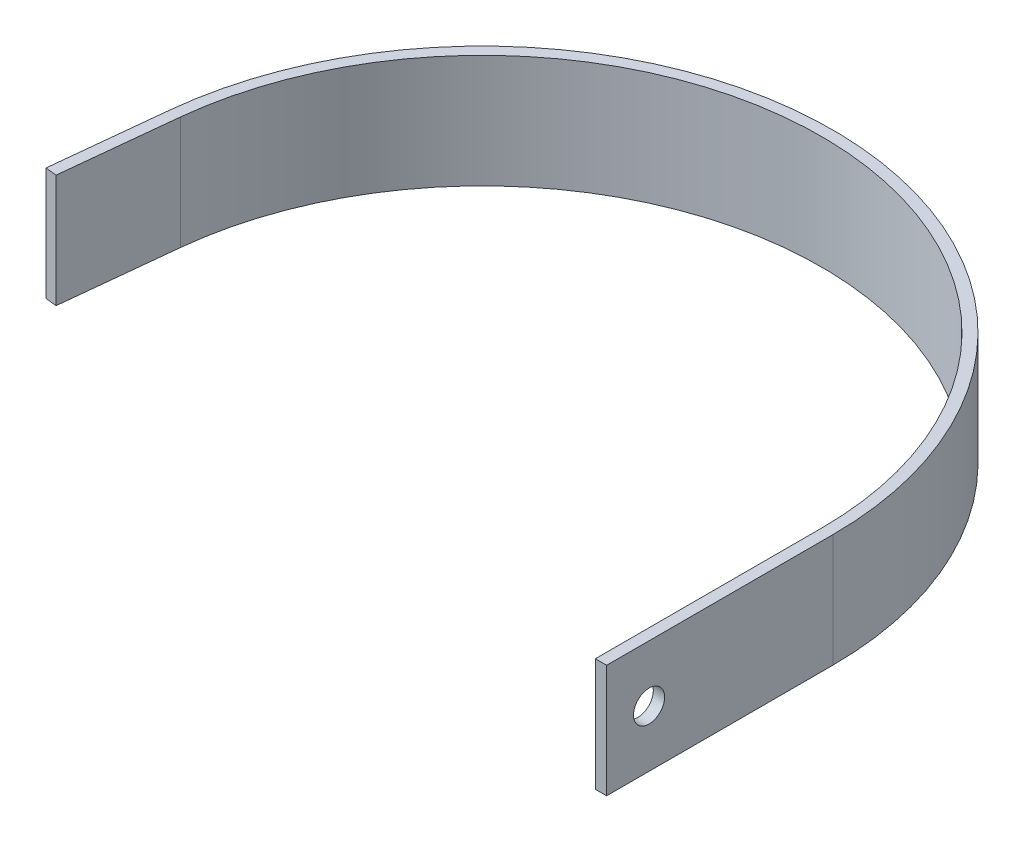
ISO-10303-21;
HEADER;
FILE_DESCRIPTION(('STEP AP214'),'2;1');
FILE_NAME('part.step','',(''),(''),'','','');
FILE_SCHEMA(('AUTOMOTIVE_DESIGN { 1 0 10303 214 1 1 1 1 }'));
ENDSEC;
DATA;
#1=APPLICATION_CONTEXT('core data for automotive mechanical design processes');
#2=APPLICATION_PROTOCOL_DEFINITION('international standard','automotive_design',2000,#1);
#3=PRODUCT_CONTEXT('',#1,'mechanical');
#4=PRODUCT('Part','Part','',(#3));
#5=PRODUCT_RELATED_PRODUCT_CATEGORY('part','',(#4));
#6=PRODUCT_DEFINITION_FORMATION('','',#4);
#7=PRODUCT_DEFINITION_CONTEXT('part definition',#1,'design');
#8=PRODUCT_DEFINITION('design','',#6,#7);
#9=PRODUCT_DEFINITION_SHAPE('','',#8);
#10=(LENGTH_UNIT() NAMED_UNIT(*) SI_UNIT(.MILLI.,.METRE.));
#11=(NAMED_UNIT(*) PLANE_ANGLE_UNIT() SI_UNIT($,.RADIAN.));
#12=(NAMED_UNIT(*) SI_UNIT($,.STERADIAN.) SOLID_ANGLE_UNIT());
#13=UNCERTAINTY_MEASURE_WITH_UNIT(LENGTH_MEASURE(1.E-05),#10,'distance_accuracy_value','');
#14=(GEOMETRIC_REPRESENTATION_CONTEXT(3) GLOBAL_UNCERTAINTY_ASSIGNED_CONTEXT((#13)) GLOBAL_UNIT_ASSIGNED_CONTEXT((#10,
#11,#12)) REPRESENTATION_CONTEXT('',''));
#15=CARTESIAN_POINT('',(0.,0.,0.));
#16=DIRECTION('',(0.,0.,1.));
#17=DIRECTION('',(1.,0.,0.));
#18=AXIS2_PLACEMENT_3D('',#15,#16,#17);
#19=CARTESIAN_POINT('',(59.1497340859762,20.,-7.68770354477943));
#20=DIRECTION('',(0.,-1.,0.));
#21=DIRECTION('',(0.,0.,-1.));
#22=AXIS2_PLACEMENT_3D('',#19,#20,#21);
#23=CYLINDRICAL_SURFACE('',#22,60.);
#24=CARTESIAN_POINT('',(59.1497340859762,0.,-7.68770354477943));
#25=DIRECTION('',(0.,-1.,0.));
#26=DIRECTION('',(0.,0.,-1.));
#27=AXIS2_PLACEMENT_3D('',#24,#25,#26);
#28=CIRCLE('',#27,60.);
#29=CARTESIAN_POINT('',(-0.521579636120151,0.,-13.9594113408387));
#30=VERTEX_POINT('',#29);
#31=CARTESIAN_POINT('',(119.149734085976,0.,-7.68770354477943));
#32=VERTEX_POINT('',#31);
#33=EDGE_CURVE('E130',#30,#32,#28,.T.);
#34=ORIENTED_EDGE('',*,*,#33,.T.);
#35=DIRECTION('',(0.,-1.,0.));
#36=VECTOR('',#35,1.);
#37=CARTESIAN_POINT('',(119.149734085976,20.,-7.68770354477943));
#38=LINE('',#37,#36);
#39=CARTESIAN_POINT('',(119.149734085976,20.,-7.68770354477943));
#40=VERTEX_POINT('',#39);
#41=EDGE_CURVE('E11',#40,#32,#38,.T.);
#42=ORIENTED_EDGE('',*,*,#41,.F.);
#43=CARTESIAN_POINT('',(59.1497340859762,20.,-7.68770354477943));
#44=DIRECTION('',(0.,-1.,0.));
#45=DIRECTION('',(0.,0.,-1.));
#46=AXIS2_PLACEMENT_3D('',#43,#44,#45);
#47=CIRCLE('',#46,60.);
#48=CARTESIAN_POINT('',(-0.521579636120151,20.,-13.9594113408387));
#49=VERTEX_POINT('',#48);
#50=EDGE_CURVE('E145',#49,#40,#47,.T.);
#51=ORIENTED_EDGE('',*,*,#50,.F.);
#52=DIRECTION('',(0.,-1.,0.));
#53=VECTOR('',#52,1.);
#54=CARTESIAN_POINT('',(-0.521579636120151,20.,-13.9594113408387));
#55=LINE('',#54,#53);
#56=EDGE_CURVE('E126',#49,#30,#55,.T.);
#57=ORIENTED_EDGE('',*,*,#56,.T.);
#58=EDGE_LOOP('',(#34,#42,#51,#57));
#59=FACE_BOUND('',#58,.T.);
#60=ADVANCED_FACE('F34',(#59),#23,.F.);
#61=CARTESIAN_POINT('',(119.149734085976,20.,-7.68770354477943));
#62=DIRECTION('',(1.,0.,0.));
#63=DIRECTION('',(0.,0.,-1.));
#64=AXIS2_PLACEMENT_3D('',#61,#62,#63);
#65=PLANE('',#64);
#66=CARTESIAN_POINT('',(119.149734085976,10.,24.8122964552206));
#67=DIRECTION('',(1.,0.,0.));
#68=DIRECTION('',(0.,0.,-1.));
#69=AXIS2_PLACEMENT_3D('',#66,#67,#68);
#70=CIRCLE('',#69,2.75);
#71=CARTESIAN_POINT('',(119.149734085976,10.,22.0622964552206));
#72=VERTEX_POINT('',#71);
#73=EDGE_CURVE('E134',#72,#72,#70,.F.);
#74=ORIENTED_EDGE('',*,*,#73,.F.);
#75=EDGE_LOOP('',(#74));
#76=FACE_BOUND('',#75,.T.);
#77=DIRECTION('',(0.,0.,1.));
#78=VECTOR('',#77,1.);
#79=CARTESIAN_POINT('',(119.149734085976,0.,-7.68770354477943));
#80=LINE('',#79,#78);
#81=CARTESIAN_POINT('',(119.149734085976,0.,32.3122964552206));
#82=VERTEX_POINT('',#81);
#83=EDGE_CURVE('E133',#32,#82,#80,.T.);
#84=ORIENTED_EDGE('',*,*,#83,.T.);
#85=DIRECTION('',(0.,-1.,0.));
#86=VECTOR('',#85,1.);
#87=CARTESIAN_POINT('',(119.149734085976,20.,32.3122964552206));
#88=LINE('',#87,#86);
#89=CARTESIAN_POINT('',(119.149734085976,20.,32.3122964552206));
#90=VERTEX_POINT('',#89);
#91=EDGE_CURVE('E42',#90,#82,#88,.T.);
#92=ORIENTED_EDGE('',*,*,#91,.F.);
#93=DIRECTION('',(0.,0.,1.));
#94=VECTOR('',#93,1.);
#95=CARTESIAN_POINT('',(119.149734085976,20.,-7.68770354477943));
#96=LINE('',#95,#94);
#97=EDGE_CURVE('E93',#40,#90,#96,.T.);
#98=ORIENTED_EDGE('',*,*,#97,.F.);
#99=ORIENTED_EDGE('',*,*,#41,.T.);
#100=EDGE_LOOP('',(#84,#92,#98,#99));
#101=FACE_BOUND('',#100,.T.);
#102=ADVANCED_FACE('F193',(#76,#101),#65,.F.);
#103=CARTESIAN_POINT('',(119.149734085976,20.,32.3122964552206));
#104=DIRECTION('',(0.,0.,-1.));
#105=DIRECTION('',(-1.,0.,0.));
#106=AXIS2_PLACEMENT_3D('',#103,#104,#105);
#107=PLANE('',#106);
#108=DIRECTION('',(1.,0.,0.));
#109=VECTOR('',#108,1.);
#110=CARTESIAN_POINT('',(119.149734085976,0.,32.3122964552206));
#111=LINE('',#110,#109);
#112=CARTESIAN_POINT('',(121.149734085976,0.,32.3122964552206));
#113=VERTEX_POINT('',#112);
#114=EDGE_CURVE('E136',#82,#113,#111,.T.);
#115=ORIENTED_EDGE('',*,*,#114,.T.);
#116=DIRECTION('',(0.,-1.,0.));
#117=VECTOR('',#116,1.);
#118=CARTESIAN_POINT('',(121.149734085976,20.,32.3122964552206));
#119=LINE('',#118,#117);
#120=CARTESIAN_POINT('',(121.149734085976,20.,32.3122964552206));
#121=VERTEX_POINT('',#120);
#122=EDGE_CURVE('E152',#121,#113,#119,.T.);
#123=ORIENTED_EDGE('',*,*,#122,.F.);
#124=DIRECTION('',(1.,0.,0.));
#125=VECTOR('',#124,1.);
#126=CARTESIAN_POINT('',(119.149734085976,20.,32.3122964552206));
#127=LINE('',#126,#125);
#128=EDGE_CURVE('E160',#90,#121,#127,.T.);
#129=ORIENTED_EDGE('',*,*,#128,.F.);
#130=ORIENTED_EDGE('',*,*,#91,.T.);
#131=EDGE_LOOP('',(#115,#123,#129,#130));
#132=FACE_BOUND('',#131,.T.);
#133=ADVANCED_FACE('F158',(#132),#107,.F.);
#134=CARTESIAN_POINT('',(121.149734085976,20.,32.3122964552206));
#135=DIRECTION('',(-1.,0.,0.));
#136=DIRECTION('',(0.,0.,1.));
#137=AXIS2_PLACEMENT_3D('',#134,#135,#136);
#138=PLANE('',#137);
#139=CARTESIAN_POINT('',(121.149734085976,10.,24.8122964552206));
#140=DIRECTION('',(1.,0.,0.));
#141=DIRECTION('',(0.,0.,-1.));
#142=AXIS2_PLACEMENT_3D('',#139,#140,#141);
#143=CIRCLE('',#142,2.75);
#144=CARTESIAN_POINT('',(121.149734085976,10.,22.0622964552206));
#145=VERTEX_POINT('',#144);
#146=EDGE_CURVE('E180',#145,#145,#143,.T.);
#147=ORIENTED_EDGE('',*,*,#146,.F.);
#148=EDGE_LOOP('',(#147));
#149=FACE_BOUND('',#148,.T.);
#150=DIRECTION('',(0.,0.,-1.));
#151=VECTOR('',#150,1.);
#152=CARTESIAN_POINT('',(121.149734085976,0.,32.3122964552206));
#153=LINE('',#152,#151);
#154=CARTESIAN_POINT('',(121.149734085976,0.,-7.68770354477949));
#155=VERTEX_POINT('',#154);
#156=EDGE_CURVE('E138',#113,#155,#153,.T.);
#157=ORIENTED_EDGE('',*,*,#156,.T.);
#158=DIRECTION('',(0.,-1.,0.));
#159=VECTOR('',#158,1.);
#160=CARTESIAN_POINT('',(121.149734085976,20.,-7.68770354477949));
#161=LINE('',#160,#159);
#162=CARTESIAN_POINT('',(121.149734085976,20.,-7.68770354477949));
#163=VERTEX_POINT('',#162);
#164=EDGE_CURVE('E149',#163,#155,#161,.T.);
#165=ORIENTED_EDGE('',*,*,#164,.F.);
#166=DIRECTION('',(0.,0.,-1.));
#167=VECTOR('',#166,1.);
#168=CARTESIAN_POINT('',(121.149734085976,20.,32.3122964552206));
#169=LINE('',#168,#167);
#170=EDGE_CURVE('E172',#121,#163,#169,.T.);
#171=ORIENTED_EDGE('',*,*,#170,.F.);
#172=ORIENTED_EDGE('',*,*,#122,.T.);
#173=EDGE_LOOP('',(#157,#165,#171,#172));
#174=FACE_BOUND('',#173,.T.);
#175=ADVANCED_FACE('F168',(#149,#174),#138,.F.);
#176=CARTESIAN_POINT('',(59.1497340859762,20.,-7.68770354477949));
#177=DIRECTION('',(0.,-1.,0.));
#178=DIRECTION('',(0.,0.,-1.));
#179=AXIS2_PLACEMENT_3D('',#176,#177,#178);
#180=CYLINDRICAL_SURFACE('',#179,62.);
#181=CARTESIAN_POINT('',(59.1497340859762,0.,-7.68770354477949));
#182=DIRECTION('',(0.,1.,0.));
#183=DIRECTION('',(0.,0.,-1.));
#184=AXIS2_PLACEMENT_3D('',#181,#182,#183);
#185=CIRCLE('',#184,62.);
#186=CARTESIAN_POINT('',(-2.51062342685671,0.,-14.168468267374));
#187=VERTEX_POINT('',#186);
#188=EDGE_CURVE('E140',#155,#187,#185,.T.);
#189=ORIENTED_EDGE('',*,*,#188,.T.);
#190=DIRECTION('',(0.,-1.,0.));
#191=VECTOR('',#190,1.);
#192=CARTESIAN_POINT('',(-2.51062342685671,20.,-14.168468267374));
#193=LINE('',#192,#191);
#194=CARTESIAN_POINT('',(-2.51062342685671,20.,-14.168468267374));
#195=VERTEX_POINT('',#194);
#196=EDGE_CURVE('E121',#195,#187,#193,.T.);
#197=ORIENTED_EDGE('',*,*,#196,.F.);
#198=CARTESIAN_POINT('',(59.1497340859762,20.,-7.68770354477949));
#199=DIRECTION('',(0.,1.,0.));
#200=DIRECTION('',(0.,0.,-1.));
#201=AXIS2_PLACEMENT_3D('',#198,#199,#200);
#202=CIRCLE('',#201,62.);
#203=EDGE_CURVE('E112',#163,#195,#202,.T.);
#204=ORIENTED_EDGE('',*,*,#203,.F.);
#205=ORIENTED_EDGE('',*,*,#164,.T.);
#206=EDGE_LOOP('',(#189,#197,#204,#205));
#207=FACE_BOUND('',#206,.T.);
#208=ADVANCED_FACE('F171',(#207),#180,.T.);
#209=CARTESIAN_POINT('',(-4.60119269220976,20.,5.72196963999151));
#210=DIRECTION('',(0.994521895368273,0.,0.104528463267653));
#211=DIRECTION('',(0.104528463267653,0.,-0.994521895368273));
#212=AXIS2_PLACEMENT_3D('',#209,#210,#211);
#213=PLANE('',#212);
#214=DIRECTION('',(-0.104528463267653,0.,0.994521895368273));
#215=VECTOR('',#214,1.);
#216=CARTESIAN_POINT('',(-4.60119269220976,0.,5.72196963999151));
#217=LINE('',#216,#215);
#218=CARTESIAN_POINT('',(-4.60119269220976,0.,5.72196963999151));
#219=VERTEX_POINT('',#218);
#220=EDGE_CURVE('E120',#187,#219,#217,.T.);
#221=ORIENTED_EDGE('',*,*,#220,.T.);
#222=DIRECTION('',(0.,-1.,0.));
#223=VECTOR('',#222,1.);
#224=CARTESIAN_POINT('',(-4.60119269220976,20.,5.72196963999151));
#225=LINE('',#224,#223);
#226=CARTESIAN_POINT('',(-4.60119269220976,20.,5.72196963999151));
#227=VERTEX_POINT('',#226);
#228=EDGE_CURVE('E117',#227,#219,#225,.T.);
#229=ORIENTED_EDGE('',*,*,#228,.F.);
#230=DIRECTION('',(-0.104528463267653,0.,0.994521895368273));
#231=VECTOR('',#230,1.);
#232=CARTESIAN_POINT('',(-4.60119269220976,20.,5.72196963999151));
#233=LINE('',#232,#231);
#234=EDGE_CURVE('E106',#195,#227,#233,.T.);
#235=ORIENTED_EDGE('',*,*,#234,.F.);
#236=ORIENTED_EDGE('',*,*,#196,.T.);
#237=EDGE_LOOP('',(#221,#229,#235,#236));
#238=FACE_BOUND('',#237,.T.);
#239=ADVANCED_FACE('F118',(#238),#213,.F.);
#240=CARTESIAN_POINT('',(-2.61214890147322,20.,5.93102656652682));
#241=DIRECTION('',(0.104528463267653,0.,-0.994521895368273));
#242=DIRECTION('',(-0.994521895368273,0.,-0.104528463267653));
#243=AXIS2_PLACEMENT_3D('',#240,#241,#242);
#244=PLANE('',#243);
#245=DIRECTION('',(0.994521895368273,0.,0.104528463267653));
#246=VECTOR('',#245,1.);
#247=CARTESIAN_POINT('',(-2.61214890147322,0.,5.93102656652682));
#248=LINE('',#247,#246);
#249=CARTESIAN_POINT('',(-2.61214890147322,0.,5.93102656652682));
#250=VERTEX_POINT('',#249);
#251=EDGE_CURVE('E79',#219,#250,#248,.T.);
#252=ORIENTED_EDGE('',*,*,#251,.T.);
#253=DIRECTION('',(0.,-1.,0.));
#254=VECTOR('',#253,1.);
#255=CARTESIAN_POINT('',(-2.61214890147322,20.,5.93102656652682));
#256=LINE('',#255,#254);
#257=CARTESIAN_POINT('',(-2.61214890147322,20.,5.93102656652682));
#258=VERTEX_POINT('',#257);
#259=EDGE_CURVE('E122',#258,#250,#256,.T.);
#260=ORIENTED_EDGE('',*,*,#259,.F.);
#261=DIRECTION('',(0.994521895368273,0.,0.104528463267653));
#262=VECTOR('',#261,1.);
#263=CARTESIAN_POINT('',(-2.61214890147322,20.,5.93102656652682));
#264=LINE('',#263,#262);
#265=EDGE_CURVE('E110',#227,#258,#264,.T.);
#266=ORIENTED_EDGE('',*,*,#265,.F.);
#267=ORIENTED_EDGE('',*,*,#228,.T.);
#268=EDGE_LOOP('',(#252,#260,#266,#267));
#269=FACE_BOUND('',#268,.T.);
#270=ADVANCED_FACE('F124',(#269),#244,.F.);
#271=CARTESIAN_POINT('',(-0.521579636120151,20.,-13.9594113408387));
#272=DIRECTION('',(-0.994521895368273,0.,-0.104528463267653));
#273=DIRECTION('',(-0.104528463267653,0.,0.994521895368273));
#274=AXIS2_PLACEMENT_3D('',#271,#272,#273);
#275=PLANE('',#274);
#276=DIRECTION('',(0.104528463267653,0.,-0.994521895368273));
#277=VECTOR('',#276,1.);
#278=CARTESIAN_POINT('',(-0.521579636120151,0.,-13.9594113408387));
#279=LINE('',#278,#277);
#280=EDGE_CURVE('E85',#250,#30,#279,.T.);
#281=ORIENTED_EDGE('',*,*,#280,.T.);
#282=ORIENTED_EDGE('',*,*,#56,.F.);
#283=DIRECTION('',(0.104528463267653,0.,-0.994521895368273));
#284=VECTOR('',#283,1.);
#285=CARTESIAN_POINT('',(-0.521579636120151,20.,-13.9594113408387));
#286=LINE('',#285,#284);
#287=EDGE_CURVE('E50',#258,#49,#286,.T.);
#288=ORIENTED_EDGE('',*,*,#287,.F.);
#289=ORIENTED_EDGE('',*,*,#259,.T.);
#290=EDGE_LOOP('',(#281,#282,#288,#289));
#291=FACE_BOUND('',#290,.T.);
#292=ADVANCED_FACE('F203',(#291),#275,.F.);
#293=CARTESIAN_POINT('',(59.1497340859762,20.,-7.68770354477943));
#294=DIRECTION('',(0.,-1.,0.));
#295=DIRECTION('',(0.,0.,-1.));
#296=AXIS2_PLACEMENT_3D('',#293,#294,#295);
#297=PLANE('',#296);
#298=ORIENTED_EDGE('',*,*,#50,.T.);
#299=ORIENTED_EDGE('',*,*,#97,.T.);
#300=ORIENTED_EDGE('',*,*,#128,.T.);
#301=ORIENTED_EDGE('',*,*,#170,.T.);
#302=ORIENTED_EDGE('',*,*,#203,.T.);
#303=ORIENTED_EDGE('',*,*,#234,.T.);
#304=ORIENTED_EDGE('',*,*,#265,.T.);
#305=ORIENTED_EDGE('',*,*,#287,.T.);
#306=EDGE_LOOP('',(#298,#299,#300,#301,#302,#303,#304,#305));
#307=FACE_BOUND('',#306,.T.);
#308=ADVANCED_FACE('F108',(#307),#297,.F.);
#309=CARTESIAN_POINT('',(59.1497340859762,0.,-7.68770354477943));
#310=DIRECTION('',(0.,-1.,0.));
#311=DIRECTION('',(0.,0.,-1.));
#312=AXIS2_PLACEMENT_3D('',#309,#310,#311);
#313=PLANE('',#312);
#314=ORIENTED_EDGE('',*,*,#33,.F.);
#315=ORIENTED_EDGE('',*,*,#280,.F.);
#316=ORIENTED_EDGE('',*,*,#251,.F.);
#317=ORIENTED_EDGE('',*,*,#220,.F.);
#318=ORIENTED_EDGE('',*,*,#188,.F.);
#319=ORIENTED_EDGE('',*,*,#156,.F.);
#320=ORIENTED_EDGE('',*,*,#114,.F.);
#321=ORIENTED_EDGE('',*,*,#83,.F.);
#322=EDGE_LOOP('',(#314,#315,#316,#317,#318,#319,#320,#321));
#323=FACE_BOUND('',#322,.T.);
#324=ADVANCED_FACE('F164',(#323),#313,.T.);
#325=CARTESIAN_POINT('',(111.371559492924,10.,24.8122964552205));
#326=DIRECTION('',(1.,0.,0.));
#327=DIRECTION('',(0.,0.,-1.));
#328=AXIS2_PLACEMENT_3D('',#325,#326,#327);
#329=CYLINDRICAL_SURFACE('',#328,2.75);
#330=ORIENTED_EDGE('',*,*,#73,.T.);
#331=EDGE_LOOP('',(#330));
#332=FACE_BOUND('',#331,.T.);
#333=ORIENTED_EDGE('',*,*,#146,.T.);
#334=EDGE_LOOP('',(#333));
#335=FACE_BOUND('',#334,.T.);
#336=ADVANCED_FACE('F184',(#332,#335),#329,.F.);
#337=CLOSED_SHELL('',(#60,#102,#133,#175,#208,#239,#270,#292,#308,#324,#336));
#338=MANIFOLD_SOLID_BREP('B2',#337);
#339=ADVANCED_BREP_SHAPE_REPRESENTATION('',(#18,#338),#14);
#340=SHAPE_DEFINITION_REPRESENTATION(#9,#339);
ENDSEC;
END-ISO-10303-21;
